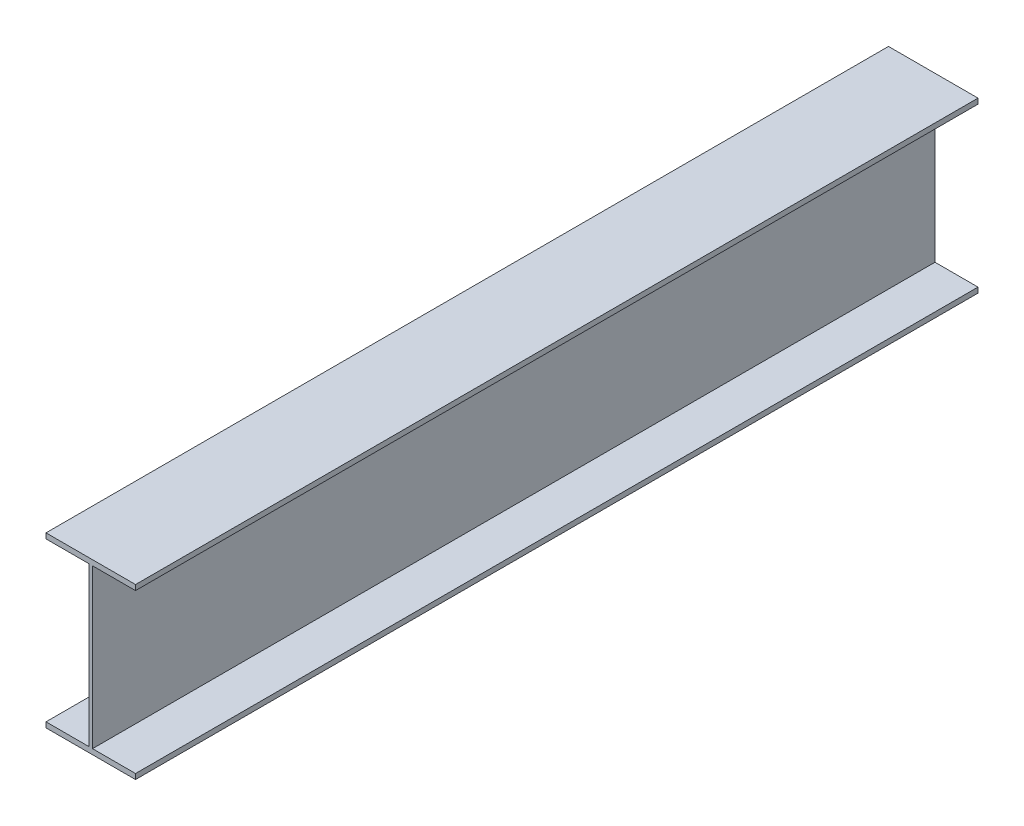
ISO-10303-21;
HEADER;
FILE_DESCRIPTION(('STEP AP214'),'2;1');
FILE_NAME('part.step','',(''),(''),'','','');
FILE_SCHEMA(('AUTOMOTIVE_DESIGN { 1 0 10303 214 1 1 1 1 }'));
ENDSEC;
DATA;
#1=APPLICATION_CONTEXT('core data for automotive mechanical design processes');
#2=APPLICATION_PROTOCOL_DEFINITION('international standard','automotive_design',2000,#1);
#3=PRODUCT_CONTEXT('',#1,'mechanical');
#4=PRODUCT('Part','Part','',(#3));
#5=PRODUCT_RELATED_PRODUCT_CATEGORY('part','',(#4));
#6=PRODUCT_DEFINITION_FORMATION('','',#4);
#7=PRODUCT_DEFINITION_CONTEXT('part definition',#1,'design');
#8=PRODUCT_DEFINITION('design','',#6,#7);
#9=PRODUCT_DEFINITION_SHAPE('','',#8);
#10=(LENGTH_UNIT() NAMED_UNIT(*) SI_UNIT(.MILLI.,.METRE.));
#11=(NAMED_UNIT(*) PLANE_ANGLE_UNIT() SI_UNIT($,.RADIAN.));
#12=(NAMED_UNIT(*) SI_UNIT($,.STERADIAN.) SOLID_ANGLE_UNIT());
#13=UNCERTAINTY_MEASURE_WITH_UNIT(LENGTH_MEASURE(1.E-05),#10,'distance_accuracy_value','');
#14=(GEOMETRIC_REPRESENTATION_CONTEXT(3) GLOBAL_UNCERTAINTY_ASSIGNED_CONTEXT((#13)) GLOBAL_UNIT_ASSIGNED_CONTEXT((#10,
#11,#12)) REPRESENTATION_CONTEXT('',''));
#15=CARTESIAN_POINT('',(0.,0.,0.));
#16=DIRECTION('',(0.,0.,1.));
#17=DIRECTION('',(1.,0.,0.));
#18=AXIS2_PLACEMENT_3D('',#15,#16,#17);
#19=CARTESIAN_POINT('',(0.,-286.512,3048.));
#20=DIRECTION('',(0.,1.,0.));
#21=DIRECTION('',(0.,0.,1.));
#22=AXIS2_PLACEMENT_3D('',#19,#20,#21);
#23=PLANE('',#22);
#24=DIRECTION('',(1.,0.,0.));
#25=VECTOR('',#24,1.);
#26=CARTESIAN_POINT('',(0.,-286.512,0.));
#27=LINE('',#26,#25);
#28=CARTESIAN_POINT('',(6.34999999999997,-286.512,0.));
#29=VERTEX_POINT('',#28);
#30=CARTESIAN_POINT('',(161.925,-286.512,0.));
#31=VERTEX_POINT('',#30);
#32=EDGE_CURVE('E156',#29,#31,#27,.T.);
#33=ORIENTED_EDGE('',*,*,#32,.F.);
#34=DIRECTION('',(0.,0.,-1.));
#35=VECTOR('',#34,1.);
#36=CARTESIAN_POINT('',(6.34999999999997,-286.512,3048.));
#37=LINE('',#36,#35);
#38=CARTESIAN_POINT('',(6.34999999999997,-286.512,3048.));
#39=VERTEX_POINT('',#38);
#40=EDGE_CURVE('E11',#39,#29,#37,.T.);
#41=ORIENTED_EDGE('',*,*,#40,.F.);
#42=DIRECTION('',(1.,0.,0.));
#43=VECTOR('',#42,1.);
#44=CARTESIAN_POINT('',(0.,-286.512,3048.));
#45=LINE('',#44,#43);
#46=CARTESIAN_POINT('',(161.925,-286.512,3048.));
#47=VERTEX_POINT('',#46);
#48=EDGE_CURVE('E242',#39,#47,#45,.T.);
#49=ORIENTED_EDGE('',*,*,#48,.T.);
#50=DIRECTION('',(0.,0.,-1.));
#51=VECTOR('',#50,1.);
#52=CARTESIAN_POINT('',(161.925,-286.512,3048.));
#53=LINE('',#52,#51);
#54=EDGE_CURVE('E100',#47,#31,#53,.T.);
#55=ORIENTED_EDGE('',*,*,#54,.T.);
#56=EDGE_LOOP('',(#33,#41,#49,#55));
#57=FACE_BOUND('',#56,.T.);
#58=ADVANCED_FACE('F38',(#57),#23,.T.);
#59=CARTESIAN_POINT('',(6.34999999999997,0.,3048.));
#60=DIRECTION('',(-1.,0.,0.));
#61=DIRECTION('',(0.,0.,1.));
#62=AXIS2_PLACEMENT_3D('',#59,#60,#61);
#63=PLANE('',#62);
#64=DIRECTION('',(0.,1.,0.));
#65=VECTOR('',#64,1.);
#66=CARTESIAN_POINT('',(6.34999999999997,0.,0.));
#67=LINE('',#66,#65);
#68=CARTESIAN_POINT('',(6.34999999999997,286.512,0.));
#69=VERTEX_POINT('',#68);
#70=EDGE_CURVE('E159',#29,#69,#67,.T.);
#71=ORIENTED_EDGE('',*,*,#70,.T.);
#72=DIRECTION('',(0.,0.,-1.));
#73=VECTOR('',#72,1.);
#74=CARTESIAN_POINT('',(6.34999999999997,286.512,3048.));
#75=LINE('',#74,#73);
#76=CARTESIAN_POINT('',(6.34999999999997,286.512,3048.));
#77=VERTEX_POINT('',#76);
#78=EDGE_CURVE('E46',#77,#69,#75,.T.);
#79=ORIENTED_EDGE('',*,*,#78,.F.);
#80=DIRECTION('',(0.,1.,0.));
#81=VECTOR('',#80,1.);
#82=CARTESIAN_POINT('',(6.34999999999997,0.,3048.));
#83=LINE('',#82,#81);
#84=EDGE_CURVE('E225',#39,#77,#83,.T.);
#85=ORIENTED_EDGE('',*,*,#84,.F.);
#86=ORIENTED_EDGE('',*,*,#40,.T.);
#87=EDGE_LOOP('',(#71,#79,#85,#86));
#88=FACE_BOUND('',#87,.T.);
#89=ADVANCED_FACE('F244',(#88),#63,.F.);
#90=CARTESIAN_POINT('',(0.,286.512,3048.));
#91=DIRECTION('',(0.,1.,0.));
#92=DIRECTION('',(0.,0.,1.));
#93=AXIS2_PLACEMENT_3D('',#90,#91,#92);
#94=PLANE('',#93);
#95=DIRECTION('',(1.,0.,0.));
#96=VECTOR('',#95,1.);
#97=CARTESIAN_POINT('',(0.,286.512,0.));
#98=LINE('',#97,#96);
#99=CARTESIAN_POINT('',(161.925,286.512,0.));
#100=VERTEX_POINT('',#99);
#101=EDGE_CURVE('E161',#69,#100,#98,.T.);
#102=ORIENTED_EDGE('',*,*,#101,.T.);
#103=DIRECTION('',(0.,0.,-1.));
#104=VECTOR('',#103,1.);
#105=CARTESIAN_POINT('',(161.925,286.512,3048.));
#106=LINE('',#105,#104);
#107=CARTESIAN_POINT('',(161.925,286.512,3048.));
#108=VERTEX_POINT('',#107);
#109=EDGE_CURVE('E197',#108,#100,#106,.T.);
#110=ORIENTED_EDGE('',*,*,#109,.F.);
#111=DIRECTION('',(1.,0.,0.));
#112=VECTOR('',#111,1.);
#113=CARTESIAN_POINT('',(0.,286.512,3048.));
#114=LINE('',#113,#112);
#115=EDGE_CURVE('E206',#77,#108,#114,.T.);
#116=ORIENTED_EDGE('',*,*,#115,.F.);
#117=ORIENTED_EDGE('',*,*,#78,.T.);
#118=EDGE_LOOP('',(#102,#110,#116,#117));
#119=FACE_BOUND('',#118,.T.);
#120=ADVANCED_FACE('F204',(#119),#94,.F.);
#121=CARTESIAN_POINT('',(161.925,0.,3048.));
#122=DIRECTION('',(-1.,0.,0.));
#123=DIRECTION('',(0.,0.,1.));
#124=AXIS2_PLACEMENT_3D('',#121,#122,#123);
#125=PLANE('',#124);
#126=DIRECTION('',(0.,1.,0.));
#127=VECTOR('',#126,1.);
#128=CARTESIAN_POINT('',(161.925,0.,0.));
#129=LINE('',#128,#127);
#130=CARTESIAN_POINT('',(161.925,305.562,0.));
#131=VERTEX_POINT('',#130);
#132=EDGE_CURVE('E163',#100,#131,#129,.T.);
#133=ORIENTED_EDGE('',*,*,#132,.T.);
#134=DIRECTION('',(0.,0.,-1.));
#135=VECTOR('',#134,1.);
#136=CARTESIAN_POINT('',(161.925,305.562,3048.));
#137=LINE('',#136,#135);
#138=CARTESIAN_POINT('',(161.925,305.562,3048.));
#139=VERTEX_POINT('',#138);
#140=EDGE_CURVE('E195',#139,#131,#137,.T.);
#141=ORIENTED_EDGE('',*,*,#140,.F.);
#142=DIRECTION('',(0.,1.,0.));
#143=VECTOR('',#142,1.);
#144=CARTESIAN_POINT('',(161.925,0.,3048.));
#145=LINE('',#144,#143);
#146=EDGE_CURVE('E219',#108,#139,#145,.T.);
#147=ORIENTED_EDGE('',*,*,#146,.F.);
#148=ORIENTED_EDGE('',*,*,#109,.T.);
#149=EDGE_LOOP('',(#133,#141,#147,#148));
#150=FACE_BOUND('',#149,.T.);
#151=ADVANCED_FACE('F216',(#150),#125,.F.);
#152=CARTESIAN_POINT('',(0.,305.562,3048.));
#153=DIRECTION('',(0.,1.,0.));
#154=DIRECTION('',(0.,0.,1.));
#155=AXIS2_PLACEMENT_3D('',#152,#153,#154);
#156=PLANE('',#155);
#157=DIRECTION('',(1.,0.,0.));
#158=VECTOR('',#157,1.);
#159=CARTESIAN_POINT('',(0.,305.562,0.));
#160=LINE('',#159,#158);
#161=CARTESIAN_POINT('',(-161.925,305.562,0.));
#162=VERTEX_POINT('',#161);
#163=EDGE_CURVE('E166',#162,#131,#160,.T.);
#164=ORIENTED_EDGE('',*,*,#163,.F.);
#165=DIRECTION('',(0.,0.,-1.));
#166=VECTOR('',#165,1.);
#167=CARTESIAN_POINT('',(-161.925,305.562,3048.));
#168=LINE('',#167,#166);
#169=CARTESIAN_POINT('',(-161.925,305.562,3048.));
#170=VERTEX_POINT('',#169);
#171=EDGE_CURVE('E193',#170,#162,#168,.T.);
#172=ORIENTED_EDGE('',*,*,#171,.F.);
#173=DIRECTION('',(1.,0.,0.));
#174=VECTOR('',#173,1.);
#175=CARTESIAN_POINT('',(0.,305.562,3048.));
#176=LINE('',#175,#174);
#177=EDGE_CURVE('E221',#170,#139,#176,.T.);
#178=ORIENTED_EDGE('',*,*,#177,.T.);
#179=ORIENTED_EDGE('',*,*,#140,.T.);
#180=EDGE_LOOP('',(#164,#172,#178,#179));
#181=FACE_BOUND('',#180,.T.);
#182=ADVANCED_FACE('F252',(#181),#156,.T.);
#183=CARTESIAN_POINT('',(-161.925,0.,3048.));
#184=DIRECTION('',(1.,0.,0.));
#185=DIRECTION('',(0.,0.,-1.));
#186=AXIS2_PLACEMENT_3D('',#183,#184,#185);
#187=PLANE('',#186);
#188=DIRECTION('',(0.,-1.,0.));
#189=VECTOR('',#188,1.);
#190=CARTESIAN_POINT('',(-161.925,0.,0.));
#191=LINE('',#190,#189);
#192=CARTESIAN_POINT('',(-161.925,286.512,0.));
#193=VERTEX_POINT('',#192);
#194=EDGE_CURVE('E170',#162,#193,#191,.T.);
#195=ORIENTED_EDGE('',*,*,#194,.T.);
#196=DIRECTION('',(0.,0.,-1.));
#197=VECTOR('',#196,1.);
#198=CARTESIAN_POINT('',(-161.925,286.512,3048.));
#199=LINE('',#198,#197);
#200=CARTESIAN_POINT('',(-161.925,286.512,3048.));
#201=VERTEX_POINT('',#200);
#202=EDGE_CURVE('E190',#201,#193,#199,.T.);
#203=ORIENTED_EDGE('',*,*,#202,.F.);
#204=DIRECTION('',(0.,-1.,0.));
#205=VECTOR('',#204,1.);
#206=CARTESIAN_POINT('',(-161.925,0.,3048.));
#207=LINE('',#206,#205);
#208=EDGE_CURVE('E223',#170,#201,#207,.T.);
#209=ORIENTED_EDGE('',*,*,#208,.F.);
#210=ORIENTED_EDGE('',*,*,#171,.T.);
#211=EDGE_LOOP('',(#195,#203,#209,#210));
#212=FACE_BOUND('',#211,.T.);
#213=ADVANCED_FACE('F255',(#212),#187,.F.);
#214=CARTESIAN_POINT('',(0.,286.512,3048.));
#215=DIRECTION('',(0.,1.,0.));
#216=DIRECTION('',(0.,0.,1.));
#217=AXIS2_PLACEMENT_3D('',#214,#215,#216);
#218=PLANE('',#217);
#219=DIRECTION('',(1.,0.,0.));
#220=VECTOR('',#219,1.);
#221=CARTESIAN_POINT('',(0.,286.512,0.));
#222=LINE('',#221,#220);
#223=CARTESIAN_POINT('',(-6.35000000000003,286.512,0.));
#224=VERTEX_POINT('',#223);
#225=EDGE_CURVE('E172',#193,#224,#222,.T.);
#226=ORIENTED_EDGE('',*,*,#225,.T.);
#227=DIRECTION('',(0.,0.,-1.));
#228=VECTOR('',#227,1.);
#229=CARTESIAN_POINT('',(-6.35000000000003,286.512,3048.));
#230=LINE('',#229,#228);
#231=CARTESIAN_POINT('',(-6.35000000000003,286.512,3048.));
#232=VERTEX_POINT('',#231);
#233=EDGE_CURVE('E188',#232,#224,#230,.T.);
#234=ORIENTED_EDGE('',*,*,#233,.F.);
#235=DIRECTION('',(1.,0.,0.));
#236=VECTOR('',#235,1.);
#237=CARTESIAN_POINT('',(0.,286.512,3048.));
#238=LINE('',#237,#236);
#239=EDGE_CURVE('E230',#201,#232,#238,.T.);
#240=ORIENTED_EDGE('',*,*,#239,.F.);
#241=ORIENTED_EDGE('',*,*,#202,.T.);
#242=EDGE_LOOP('',(#226,#234,#240,#241));
#243=FACE_BOUND('',#242,.T.);
#244=ADVANCED_FACE('F259',(#243),#218,.F.);
#245=CARTESIAN_POINT('',(-6.35000000000003,0.,3048.));
#246=DIRECTION('',(-1.,0.,0.));
#247=DIRECTION('',(0.,0.,1.));
#248=AXIS2_PLACEMENT_3D('',#245,#246,#247);
#249=PLANE('',#248);
#250=DIRECTION('',(0.,1.,0.));
#251=VECTOR('',#250,1.);
#252=CARTESIAN_POINT('',(-6.35000000000003,0.,0.));
#253=LINE('',#252,#251);
#254=CARTESIAN_POINT('',(-6.35000000000003,-286.512,0.));
#255=VERTEX_POINT('',#254);
#256=EDGE_CURVE('E175',#255,#224,#253,.T.);
#257=ORIENTED_EDGE('',*,*,#256,.F.);
#258=DIRECTION('',(0.,0.,-1.));
#259=VECTOR('',#258,1.);
#260=CARTESIAN_POINT('',(-6.35000000000003,-286.512,3048.));
#261=LINE('',#260,#259);
#262=CARTESIAN_POINT('',(-6.35000000000003,-286.512,3048.));
#263=VERTEX_POINT('',#262);
#264=EDGE_CURVE('E186',#263,#255,#261,.T.);
#265=ORIENTED_EDGE('',*,*,#264,.F.);
#266=DIRECTION('',(0.,1.,0.));
#267=VECTOR('',#266,1.);
#268=CARTESIAN_POINT('',(-6.35000000000003,0.,3048.));
#269=LINE('',#268,#267);
#270=EDGE_CURVE('E152',#263,#232,#269,.T.);
#271=ORIENTED_EDGE('',*,*,#270,.T.);
#272=ORIENTED_EDGE('',*,*,#233,.T.);
#273=EDGE_LOOP('',(#257,#265,#271,#272));
#274=FACE_BOUND('',#273,.T.);
#275=ADVANCED_FACE('F234',(#274),#249,.T.);
#276=CARTESIAN_POINT('',(0.,-286.512,3048.));
#277=DIRECTION('',(0.,1.,0.));
#278=DIRECTION('',(0.,0.,1.));
#279=AXIS2_PLACEMENT_3D('',#276,#277,#278);
#280=PLANE('',#279);
#281=DIRECTION('',(1.,0.,0.));
#282=VECTOR('',#281,1.);
#283=CARTESIAN_POINT('',(0.,-286.512,0.));
#284=LINE('',#283,#282);
#285=CARTESIAN_POINT('',(-161.925,-286.512,0.));
#286=VERTEX_POINT('',#285);
#287=EDGE_CURVE('E178',#286,#255,#284,.T.);
#288=ORIENTED_EDGE('',*,*,#287,.F.);
#289=DIRECTION('',(0.,0.,-1.));
#290=VECTOR('',#289,1.);
#291=CARTESIAN_POINT('',(-161.925,-286.512,3048.));
#292=LINE('',#291,#290);
#293=CARTESIAN_POINT('',(-161.925,-286.512,3048.));
#294=VERTEX_POINT('',#293);
#295=EDGE_CURVE('E140',#294,#286,#292,.T.);
#296=ORIENTED_EDGE('',*,*,#295,.F.);
#297=DIRECTION('',(1.,0.,0.));
#298=VECTOR('',#297,1.);
#299=CARTESIAN_POINT('',(0.,-286.512,3048.));
#300=LINE('',#299,#298);
#301=EDGE_CURVE('E150',#294,#263,#300,.T.);
#302=ORIENTED_EDGE('',*,*,#301,.T.);
#303=ORIENTED_EDGE('',*,*,#264,.T.);
#304=EDGE_LOOP('',(#288,#296,#302,#303));
#305=FACE_BOUND('',#304,.T.);
#306=ADVANCED_FACE('F239',(#305),#280,.T.);
#307=CARTESIAN_POINT('',(-161.925,0.,3048.));
#308=DIRECTION('',(-1.,0.,0.));
#309=DIRECTION('',(0.,0.,1.));
#310=AXIS2_PLACEMENT_3D('',#307,#308,#309);
#311=PLANE('',#310);
#312=DIRECTION('',(0.,1.,0.));
#313=VECTOR('',#312,1.);
#314=CARTESIAN_POINT('',(-161.925,0.,0.));
#315=LINE('',#314,#313);
#316=CARTESIAN_POINT('',(-161.925,-305.562,0.));
#317=VERTEX_POINT('',#316);
#318=EDGE_CURVE('E139',#317,#286,#315,.T.);
#319=ORIENTED_EDGE('',*,*,#318,.F.);
#320=DIRECTION('',(0.,0.,-1.));
#321=VECTOR('',#320,1.);
#322=CARTESIAN_POINT('',(-161.925,-305.562,3048.));
#323=LINE('',#322,#321);
#324=CARTESIAN_POINT('',(-161.925,-305.562,3048.));
#325=VERTEX_POINT('',#324);
#326=EDGE_CURVE('E133',#325,#317,#323,.T.);
#327=ORIENTED_EDGE('',*,*,#326,.F.);
#328=DIRECTION('',(0.,1.,0.));
#329=VECTOR('',#328,1.);
#330=CARTESIAN_POINT('',(-161.925,0.,3048.));
#331=LINE('',#330,#329);
#332=EDGE_CURVE('E137',#325,#294,#331,.T.);
#333=ORIENTED_EDGE('',*,*,#332,.T.);
#334=ORIENTED_EDGE('',*,*,#295,.T.);
#335=EDGE_LOOP('',(#319,#327,#333,#334));
#336=FACE_BOUND('',#335,.T.);
#337=ADVANCED_FACE('F135',(#336),#311,.T.);
#338=CARTESIAN_POINT('',(0.,-305.562,3048.));
#339=DIRECTION('',(0.,1.,0.));
#340=DIRECTION('',(0.,0.,1.));
#341=AXIS2_PLACEMENT_3D('',#338,#339,#340);
#342=PLANE('',#341);
#343=DIRECTION('',(1.,0.,0.));
#344=VECTOR('',#343,1.);
#345=CARTESIAN_POINT('',(0.,-305.562,0.));
#346=LINE('',#345,#344);
#347=CARTESIAN_POINT('',(161.925,-305.562,0.));
#348=VERTEX_POINT('',#347);
#349=EDGE_CURVE('E93',#317,#348,#346,.T.);
#350=ORIENTED_EDGE('',*,*,#349,.T.);
#351=DIRECTION('',(0.,0.,-1.));
#352=VECTOR('',#351,1.);
#353=CARTESIAN_POINT('',(161.925,-305.562,3048.));
#354=LINE('',#353,#352);
#355=CARTESIAN_POINT('',(161.925,-305.562,3048.));
#356=VERTEX_POINT('',#355);
#357=EDGE_CURVE('E141',#356,#348,#354,.T.);
#358=ORIENTED_EDGE('',*,*,#357,.F.);
#359=DIRECTION('',(1.,0.,0.));
#360=VECTOR('',#359,1.);
#361=CARTESIAN_POINT('',(0.,-305.562,3048.));
#362=LINE('',#361,#360);
#363=EDGE_CURVE('E143',#325,#356,#362,.T.);
#364=ORIENTED_EDGE('',*,*,#363,.F.);
#365=ORIENTED_EDGE('',*,*,#326,.T.);
#366=EDGE_LOOP('',(#350,#358,#364,#365));
#367=FACE_BOUND('',#366,.T.);
#368=ADVANCED_FACE('F144',(#367),#342,.F.);
#369=EDGE_CURVE('E167',#348,#31,#129,.T.);
#370=ORIENTED_EDGE('',*,*,#369,.T.);
#371=ORIENTED_EDGE('',*,*,#54,.F.);
#372=EDGE_CURVE('E54',#356,#47,#145,.T.);
#373=ORIENTED_EDGE('',*,*,#372,.F.);
#374=ORIENTED_EDGE('',*,*,#357,.T.);
#375=EDGE_LOOP('',(#370,#371,#373,#374));
#376=FACE_BOUND('',#375,.T.);
#377=ADVANCED_FACE('F272',(#376),#125,.F.);
#378=CARTESIAN_POINT('',(0.,0.,3048.));
#379=DIRECTION('',(0.,0.,1.));
#380=DIRECTION('',(1.,0.,0.));
#381=AXIS2_PLACEMENT_3D('',#378,#379,#380);
#382=PLANE('',#381);
#383=ORIENTED_EDGE('',*,*,#48,.F.);
#384=ORIENTED_EDGE('',*,*,#84,.T.);
#385=ORIENTED_EDGE('',*,*,#115,.T.);
#386=ORIENTED_EDGE('',*,*,#146,.T.);
#387=ORIENTED_EDGE('',*,*,#177,.F.);
#388=ORIENTED_EDGE('',*,*,#208,.T.);
#389=ORIENTED_EDGE('',*,*,#239,.T.);
#390=ORIENTED_EDGE('',*,*,#270,.F.);
#391=ORIENTED_EDGE('',*,*,#301,.F.);
#392=ORIENTED_EDGE('',*,*,#332,.F.);
#393=ORIENTED_EDGE('',*,*,#363,.T.);
#394=ORIENTED_EDGE('',*,*,#372,.T.);
#395=EDGE_LOOP('',(#383,#384,#385,#386,#387,#388,#389,#390,#391,#392,#393,#394));
#396=FACE_BOUND('',#395,.T.);
#397=ADVANCED_FACE('F147',(#396),#382,.T.);
#398=CARTESIAN_POINT('',(0.,0.,0.));
#399=DIRECTION('',(0.,0.,1.));
#400=DIRECTION('',(1.,0.,0.));
#401=AXIS2_PLACEMENT_3D('',#398,#399,#400);
#402=PLANE('',#401);
#403=ORIENTED_EDGE('',*,*,#32,.T.);
#404=ORIENTED_EDGE('',*,*,#369,.F.);
#405=ORIENTED_EDGE('',*,*,#349,.F.);
#406=ORIENTED_EDGE('',*,*,#318,.T.);
#407=ORIENTED_EDGE('',*,*,#287,.T.);
#408=ORIENTED_EDGE('',*,*,#256,.T.);
#409=ORIENTED_EDGE('',*,*,#225,.F.);
#410=ORIENTED_EDGE('',*,*,#194,.F.);
#411=ORIENTED_EDGE('',*,*,#163,.T.);
#412=ORIENTED_EDGE('',*,*,#132,.F.);
#413=ORIENTED_EDGE('',*,*,#101,.F.);
#414=ORIENTED_EDGE('',*,*,#70,.F.);
#415=EDGE_LOOP('',(#403,#404,#405,#406,#407,#408,#409,#410,#411,#412,#413,#414));
#416=FACE_BOUND('',#415,.T.);
#417=ADVANCED_FACE('F211',(#416),#402,.F.);
#418=CLOSED_SHELL('',(#58,#89,#120,#151,#182,#213,#244,#275,#306,#337,#368,#377,#397,#417));
#419=MANIFOLD_SOLID_BREP('B2',#418);
#420=ADVANCED_BREP_SHAPE_REPRESENTATION('',(#18,#419),#14);
#421=SHAPE_DEFINITION_REPRESENTATION(#9,#420);
ENDSEC;
END-ISO-10303-21;
